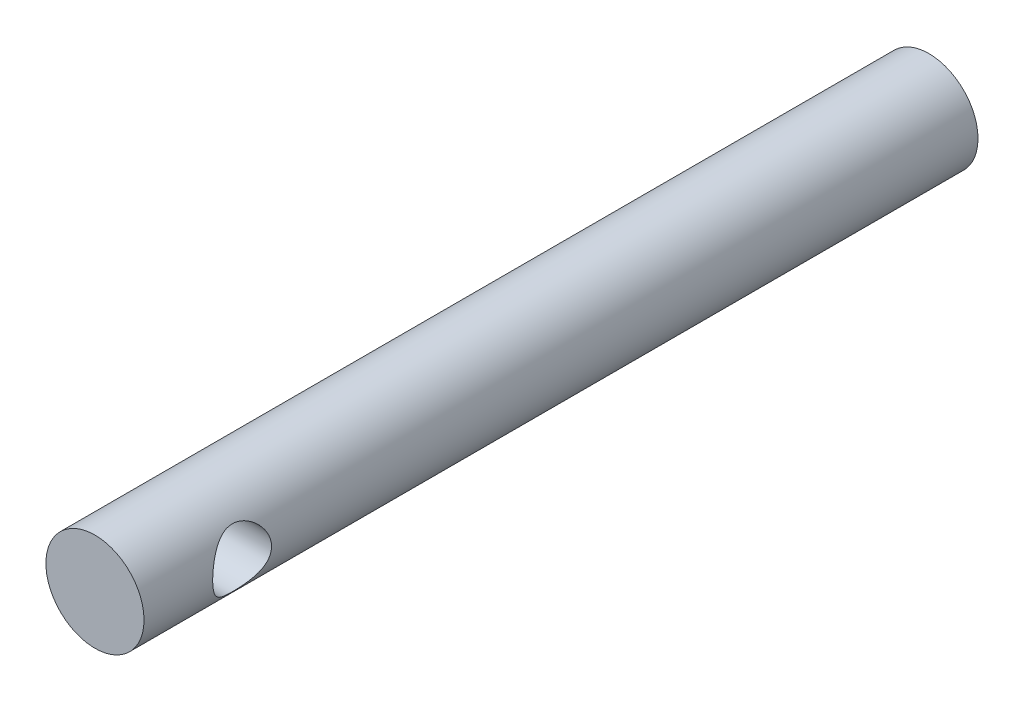
ISO-10303-21;
HEADER;
FILE_DESCRIPTION(('STEP AP214'),'2;1');
FILE_NAME('part.step','',(''),(''),'','','');
FILE_SCHEMA(('AUTOMOTIVE_DESIGN { 1 0 10303 214 1 1 1 1 }'));
ENDSEC;
DATA;
#1=APPLICATION_CONTEXT('core data for automotive mechanical design processes');
#2=APPLICATION_PROTOCOL_DEFINITION('international standard','automotive_design',2000,#1);
#3=PRODUCT_CONTEXT('',#1,'mechanical');
#4=PRODUCT('Part','Part','',(#3));
#5=PRODUCT_RELATED_PRODUCT_CATEGORY('part','',(#4));
#6=PRODUCT_DEFINITION_FORMATION('','',#4);
#7=PRODUCT_DEFINITION_CONTEXT('part definition',#1,'design');
#8=PRODUCT_DEFINITION('design','',#6,#7);
#9=PRODUCT_DEFINITION_SHAPE('','',#8);
#10=(LENGTH_UNIT() NAMED_UNIT(*) SI_UNIT(.MILLI.,.METRE.));
#11=(NAMED_UNIT(*) PLANE_ANGLE_UNIT() SI_UNIT($,.RADIAN.));
#12=(NAMED_UNIT(*) SI_UNIT($,.STERADIAN.) SOLID_ANGLE_UNIT());
#13=UNCERTAINTY_MEASURE_WITH_UNIT(LENGTH_MEASURE(1.E-05),#10,'distance_accuracy_value','');
#14=(GEOMETRIC_REPRESENTATION_CONTEXT(3) GLOBAL_UNCERTAINTY_ASSIGNED_CONTEXT((#13)) GLOBAL_UNIT_ASSIGNED_CONTEXT((#10,
#11,#12)) REPRESENTATION_CONTEXT('',''));
#15=CARTESIAN_POINT('',(0.,0.,0.));
#16=DIRECTION('',(0.,0.,1.));
#17=DIRECTION('',(1.,0.,0.));
#18=AXIS2_PLACEMENT_3D('',#15,#16,#17);
#19=CARTESIAN_POINT('',(0.,0.,42.5));
#20=DIRECTION('',(0.,0.,-1.));
#21=DIRECTION('',(-1.,0.,0.));
#22=AXIS2_PLACEMENT_3D('',#19,#20,#21);
#23=CYLINDRICAL_SURFACE('',#22,2.5);
#24=CARTESIAN_POINT('',(-2.5,0.,39.));
#25=CARTESIAN_POINT('',(-2.49999625789732,-0.076729833462016,38.9999959089901));
#26=CARTESIAN_POINT('',(-2.4964290461501,-0.153582320644178,38.9940713290737));
#27=CARTESIAN_POINT('',(-2.48249903608568,-0.304975509530679,38.9706756804847));
#28=CARTESIAN_POINT('',(-2.47211948032719,-0.379510034596047,38.9531761381458));
#29=CARTESIAN_POINT('',(-2.44561558054488,-0.523751827790838,38.9076136388332));
#30=CARTESIAN_POINT('',(-2.42951973272944,-0.593481028226568,38.8796030418369));
#31=CARTESIAN_POINT('',(-2.39295367626407,-0.727030318214661,38.814139666859));
#32=CARTESIAN_POINT('',(-2.37248455380255,-0.790851869416385,38.7766892330313));
#33=CARTESIAN_POINT('',(-2.32705360719087,-0.916299278999317,38.6902251732914));
#34=CARTESIAN_POINT('',(-2.30186792195985,-0.977384020081419,38.6405463046486));
#35=CARTESIAN_POINT('',(-2.25030439279633,-1.09088270411891,38.5325327961717));
#36=CARTESIAN_POINT('',(-2.2239250515357,-1.14328534948113,38.4741870628127));
#37=CARTESIAN_POINT('',(-2.1691106699591,-1.24444996762974,38.3420764895033));
#38=CARTESIAN_POINT('',(-2.14082017703649,-1.29197766378809,38.2672982290187));
#39=CARTESIAN_POINT('',(-2.08938301412124,-1.37361437764897,38.1091534267569));
#40=CARTESIAN_POINT('',(-2.06622802273937,-1.4077451733516,38.0258011037524));
#41=CARTESIAN_POINT('',(-2.0335462966093,-1.45440601714222,37.8734035493468));
#42=CARTESIAN_POINT('',(-2.02207883137591,-1.47016197246827,37.8057640013897));
#43=CARTESIAN_POINT('',(-2.00590308295502,-1.49216172340475,37.6681962841696));
#44=CARTESIAN_POINT('',(-2.00118639643759,-1.49841734556836,37.5982710712455));
#45=CARTESIAN_POINT('',(-1.99920922463856,-1.50105508796009,37.4579885057827));
#46=CARTESIAN_POINT('',(-2.00196337012717,-1.49741783408419,37.3876305749068));
#47=CARTESIAN_POINT('',(-2.01453261443741,-1.48046060478828,37.2487212245724));
#48=CARTESIAN_POINT('',(-2.02435302432225,-1.46713334620103,37.1801712041526));
#49=CARTESIAN_POINT('',(-2.04953186944258,-1.43173921881793,37.0474697578719));
#50=CARTESIAN_POINT('',(-2.06481711652537,-1.40978748666088,36.9832729460755));
#51=CARTESIAN_POINT('',(-2.09927051350828,-1.35795061770838,36.8593050090719));
#52=CARTESIAN_POINT('',(-2.11844008623464,-1.32806257259706,36.7995355165761));
#53=CARTESIAN_POINT('',(-2.16255327268985,-1.25517983184584,36.6750159028772));
#54=CARTESIAN_POINT('',(-2.18792043372991,-1.21080724397724,36.6112219070451));
#55=CARTESIAN_POINT('',(-2.2393059976438,-1.11291092784004,36.491323516333));
#56=CARTESIAN_POINT('',(-2.26532500262149,-1.0593784510058,36.4352265660235));
#57=CARTESIAN_POINT('',(-2.31935504958316,-0.935811834382984,36.3243870181783));
#58=CARTESIAN_POINT('',(-2.34713836268532,-0.864517682704975,36.270922693984));
#59=CARTESIAN_POINT('',(-2.3977242843398,-0.712276050459019,36.1768779528021));
#60=CARTESIAN_POINT('',(-2.42052955425515,-0.631333763943582,36.1362906462101));
#61=CARTESIAN_POINT('',(-2.45730392066151,-0.467197585268224,36.0720678172041));
#62=CARTESIAN_POINT('',(-2.47173957439703,-0.384467624173599,36.0475246442841));
#63=CARTESIAN_POINT('',(-2.4921884281355,-0.215047895144658,36.0129888025946));
#64=CARTESIAN_POINT('',(-2.49821172952738,-0.128363005661338,36.0029786822464));
#65=CARTESIAN_POINT('',(-2.5009057037461,0.0337146143773781,35.9984921523217));
#66=CARTESIAN_POINT('',(-2.49873521714286,0.1090424734187,36.0020911449148));
#67=CARTESIAN_POINT('',(-2.48778712087049,0.257829401986045,36.0204258530719));
#68=CARTESIAN_POINT('',(-2.47900964518038,0.331288509376091,36.0351613428058));
#69=CARTESIAN_POINT('',(-2.45594792442191,0.472574932157598,36.0745434328125));
#70=CARTESIAN_POINT('',(-2.44180275662556,0.540495750928468,36.0989403490735));
#71=CARTESIAN_POINT('',(-2.40913880862845,0.671265749087247,36.1566773763653));
#72=CARTESIAN_POINT('',(-2.39061916586512,0.734113924963894,36.1900192513467));
#73=CARTESIAN_POINT('',(-2.34845496237361,0.860006262823851,36.2685569792087));
#74=CARTESIAN_POINT('',(-2.3244780273988,0.922394150456825,36.3146238290784));
#75=CARTESIAN_POINT('',(-2.27474265574732,1.03902603131013,36.4153913934886));
#76=CARTESIAN_POINT('',(-2.24898216586361,1.09326040273737,36.4701021548525));
#77=CARTESIAN_POINT('',(-2.19445423909891,1.19931996735578,36.5949103900371));
#78=CARTESIAN_POINT('',(-2.16573241746292,1.24991019630914,36.6660838854655));
#79=CARTESIAN_POINT('',(-2.1121618206671,1.33845238915667,36.8172160245682));
#80=CARTESIAN_POINT('',(-2.0873089799769,1.37641766769781,36.8971652938928));
#81=CARTESIAN_POINT('',(-2.04984909240519,1.43142578795776,37.0462430223067));
#82=CARTESIAN_POINT('',(-2.03575659328729,1.4512162533619,37.1139803123586));
#83=CARTESIAN_POINT('',(-2.01409605743544,1.48113663905972,37.2525320780801));
#84=CARTESIAN_POINT('',(-2.0065189764272,1.49127995297631,37.3233421443278));
#85=CARTESIAN_POINT('',(-1.99900446616267,1.50134130416632,37.466376947597));
#86=CARTESIAN_POINT('',(-1.99909576445937,1.50122089107869,37.538605990687));
#87=CARTESIAN_POINT('',(-2.0069771789285,1.49066472959328,37.6818944356095));
#88=CARTESIAN_POINT('',(-2.0147714813882,1.48022337215759,37.7529531800806));
#89=CARTESIAN_POINT('',(-2.03633185242979,1.45040174148914,37.8884884175722));
#90=CARTESIAN_POINT('',(-2.0497921180558,1.43147636845352,37.9531170943069));
#91=CARTESIAN_POINT('',(-2.08105501960151,1.38563242076994,38.0783372544742));
#92=CARTESIAN_POINT('',(-2.09885929040482,1.3587108358848,38.1389272069605));
#93=CARTESIAN_POINT('',(-2.14012990550916,1.29289245555734,38.2643198572208));
#94=CARTESIAN_POINT('',(-2.16404587582639,1.25279167675754,38.3283411038543));
#95=CARTESIAN_POINT('',(-2.21320127030767,1.16375698389086,38.4493800726173));
#96=CARTESIAN_POINT('',(-2.2384417720502,1.114815796078,38.5063919621525));
#97=CARTESIAN_POINT('',(-2.29225690291476,1.00009777425736,38.6213509491317));
#98=CARTESIAN_POINT('',(-2.32070308663657,0.932876819313924,38.6779310748962));
#99=CARTESIAN_POINT('',(-2.37365428872367,0.78846243444561,38.7790978558633));
#100=CARTESIAN_POINT('',(-2.39815789310935,0.71126544450156,38.8236802119848));
#101=CARTESIAN_POINT('',(-2.43985578654394,0.551125230801473,38.8977858075737));
#102=CARTESIAN_POINT('',(-2.45725077479786,0.468430086957234,38.9277280649268));
#103=CARTESIAN_POINT('',(-2.48366273001246,0.297973306118827,38.972724695211));
#104=CARTESIAN_POINT('',(-2.49271125871485,0.21023209964863,38.987835167857));
#105=CARTESIAN_POINT('',(-2.49802001168187,0.10155809691755,38.9966974547087));
#106=CARTESIAN_POINT('',(-2.49876114656362,0.081276259028289,38.9979344173061));
#107=CARTESIAN_POINT('',(-2.49975164517367,0.0406658206871182,38.9995862463709));
#108=CARTESIAN_POINT('',(-2.50000099184316,0.0203372186375724,39.0000010843209));
#109=CARTESIAN_POINT('',(-2.5,0.,39.));
#110=B_SPLINE_CURVE_WITH_KNOTS('',3,(#24,#25,#26,#27,#28,#29,#30,#31,#32,#33,#34,#35,#36,#37,
#38,#39,#40,#41,#42,#43,#44,#45,#46,#47,#48,#49,#50,#51,#52,#53,#54,#55,#56,#57,#58,#59,#60,#61,
#62,#63,#64,#65,#66,#67,#68,#69,#70,#71,#72,#73,#74,#75,#76,#77,#78,#79,#80,#81,#82,#83,#84,#85,
#86,#87,#88,#89,#90,#91,#92,#93,#94,#95,#96,#97,#98,#99,#100,#101,#102,#103,#104,#105,#106,#107,
#108,#109),.UNSPECIFIED.,.T.,.F.,(4,2,2,2,2,2,2,2,2,2,2,2,2,2,2,2,2,2,2,2,2,2,2,2,2,2,2,2,2,2,2,
2,2,2,2,2,2,2,2,2,2,2,4),(0.,0.230102237548649,0.460772627520013,0.690308884600014,
0.919788197992279,1.16681590732473,1.41416257934801,1.69183813189807,1.96906040692092,
2.17933829855633,2.38935420916578,2.59978170870726,2.81036753273872,3.01823267593206,
3.22617409809868,3.47046995225162,3.71500044803673,3.9936095788469,4.27206939275324,
4.53296790696559,4.79355286918235,5.01875602722426,5.24395461863455,5.46367785689771,
5.68344445659025,5.92601365818362,6.16886690081836,6.44336762428009,6.71757792616456,
6.93257787314693,7.14727888733319,7.36278425777434,7.57840681155726,7.78364098331142,
7.98895251523035,8.22578610052286,8.46281544370208,8.73854311775519,9.01436946031985,
9.28175654462678,9.54812832184449,9.60911473335179,9.67010326027643),.UNSPECIFIED.);
#111=CARTESIAN_POINT('',(-2.5,0.,39.));
#112=VERTEX_POINT('',#111);
#113=EDGE_CURVE('E35',#112,#112,#110,.T.);
#114=ORIENTED_EDGE('',*,*,#113,.T.);
#115=EDGE_LOOP('',(#114));
#116=FACE_BOUND('',#115,.T.);
#117=CARTESIAN_POINT('',(2.5,0.,36.));
#118=CARTESIAN_POINT('',(2.49999625789732,-0.0767298334620158,36.0000040910099));
#119=CARTESIAN_POINT('',(2.4964290461501,-0.153582320644178,36.0059286709263));
#120=CARTESIAN_POINT('',(2.48249903608568,-0.304975509530679,36.0293243195153));
#121=CARTESIAN_POINT('',(2.47211948032719,-0.379510034596047,36.0468238618542));
#122=CARTESIAN_POINT('',(2.44561558054488,-0.523751827790836,36.0923863611669));
#123=CARTESIAN_POINT('',(2.42951973272944,-0.593481028226564,36.1203969581632));
#124=CARTESIAN_POINT('',(2.39295367626407,-0.727030318214658,36.185860333141));
#125=CARTESIAN_POINT('',(2.37248455380255,-0.790851869416383,36.2233107669687));
#126=CARTESIAN_POINT('',(2.32705360719087,-0.916299278999317,36.3097748267086));
#127=CARTESIAN_POINT('',(2.30186792195985,-0.977384020081419,36.3594536953514));
#128=CARTESIAN_POINT('',(2.25030439279633,-1.09088270411891,36.4674672038283));
#129=CARTESIAN_POINT('',(2.2239250515357,-1.14328534948113,36.5258129371873));
#130=CARTESIAN_POINT('',(2.1691106699591,-1.24444996762974,36.6579235104967));
#131=CARTESIAN_POINT('',(2.14082017703649,-1.29197766378809,36.7327017709813));
#132=CARTESIAN_POINT('',(2.08938301412124,-1.37361437764897,36.8908465732431));
#133=CARTESIAN_POINT('',(2.06622802273937,-1.4077451733516,36.9741988962476));
#134=CARTESIAN_POINT('',(2.0335462966093,-1.45440601714222,37.1265964506532));
#135=CARTESIAN_POINT('',(2.02207883137591,-1.47016197246827,37.1942359986103));
#136=CARTESIAN_POINT('',(2.00590308295502,-1.49216172340475,37.3318037158304));
#137=CARTESIAN_POINT('',(2.00118639643759,-1.49841734556836,37.4017289287545));
#138=CARTESIAN_POINT('',(1.99920922463856,-1.50105508796009,37.5420114942173));
#139=CARTESIAN_POINT('',(2.00196337012717,-1.49741783408419,37.6123694250932));
#140=CARTESIAN_POINT('',(2.01453261443741,-1.48046060478828,37.7512787754276));
#141=CARTESIAN_POINT('',(2.02435302432225,-1.46713334620103,37.8198287958474));
#142=CARTESIAN_POINT('',(2.04953186944258,-1.43173921881793,37.9525302421281));
#143=CARTESIAN_POINT('',(2.06481711652537,-1.40978748666088,38.0167270539245));
#144=CARTESIAN_POINT('',(2.09927051350828,-1.35795061770838,38.1406949909281));
#145=CARTESIAN_POINT('',(2.11844008623464,-1.32806257259706,38.2004644834239));
#146=CARTESIAN_POINT('',(2.16255327268985,-1.25517983184584,38.3249840971228));
#147=CARTESIAN_POINT('',(2.18792043372991,-1.21080724397724,38.3887780929549));
#148=CARTESIAN_POINT('',(2.2393059976438,-1.11291092784004,38.508676483667));
#149=CARTESIAN_POINT('',(2.26532500262149,-1.0593784510058,38.5647734339765));
#150=CARTESIAN_POINT('',(2.31935504958316,-0.935811834382983,38.6756129818218));
#151=CARTESIAN_POINT('',(2.34713836268532,-0.864517682704973,38.729077306016));
#152=CARTESIAN_POINT('',(2.3977242843398,-0.712276050459017,38.8231220471979));
#153=CARTESIAN_POINT('',(2.42052955425515,-0.631333763943581,38.86370935379));
#154=CARTESIAN_POINT('',(2.45730392066151,-0.467197585268224,38.9279321827959));
#155=CARTESIAN_POINT('',(2.47173957439703,-0.384467624173598,38.9524753557159));
#156=CARTESIAN_POINT('',(2.4921884281355,-0.215047895144657,38.9870111974054));
#157=CARTESIAN_POINT('',(2.49821172952738,-0.128363005661337,38.9970213177536));
#158=CARTESIAN_POINT('',(2.5009057037461,0.0337146143773784,39.0015078476783));
#159=CARTESIAN_POINT('',(2.49873521714286,0.109042473418701,38.9979088550852));
#160=CARTESIAN_POINT('',(2.48778712087049,0.257829401986045,38.9795741469281));
#161=CARTESIAN_POINT('',(2.47900964518038,0.331288509376091,38.9648386571942));
#162=CARTESIAN_POINT('',(2.45594792442191,0.472574932157598,38.9254565671876));
#163=CARTESIAN_POINT('',(2.44180275662556,0.540495750928468,38.9010596509265));
#164=CARTESIAN_POINT('',(2.40913880862845,0.671265749087247,38.8433226236347));
#165=CARTESIAN_POINT('',(2.39061916586512,0.734113924963894,38.8099807486533));
#166=CARTESIAN_POINT('',(2.34845496237361,0.860006262823851,38.7314430207913));
#167=CARTESIAN_POINT('',(2.3244780273988,0.922394150456825,38.6853761709216));
#168=CARTESIAN_POINT('',(2.27474265574732,1.03902603131013,38.5846086065114));
#169=CARTESIAN_POINT('',(2.24898216586361,1.09326040273737,38.5298978451475));
#170=CARTESIAN_POINT('',(2.19445423909891,1.19931996735578,38.4050896099629));
#171=CARTESIAN_POINT('',(2.16573241746292,1.24991019630914,38.3339161145345));
#172=CARTESIAN_POINT('',(2.1121618206671,1.33845238915667,38.1827839754318));
#173=CARTESIAN_POINT('',(2.0873089799769,1.37641766769781,38.1028347061072));
#174=CARTESIAN_POINT('',(2.04984909240519,1.43142578795776,37.9537569776933));
#175=CARTESIAN_POINT('',(2.03575659328729,1.4512162533619,37.8860196876414));
#176=CARTESIAN_POINT('',(2.01409605743544,1.48113663905972,37.7474679219199));
#177=CARTESIAN_POINT('',(2.0065189764272,1.49127995297631,37.6766578556722));
#178=CARTESIAN_POINT('',(1.99900446616267,1.50134130416632,37.533623052403));
#179=CARTESIAN_POINT('',(1.99909576445937,1.50122089107869,37.461394009313));
#180=CARTESIAN_POINT('',(2.0069771789285,1.49066472959328,37.3181055643906));
#181=CARTESIAN_POINT('',(2.0147714813882,1.48022337215759,37.2470468199194));
#182=CARTESIAN_POINT('',(2.03633185242979,1.45040174148914,37.1115115824278));
#183=CARTESIAN_POINT('',(2.0497921180558,1.43147636845352,37.0468829056932));
#184=CARTESIAN_POINT('',(2.08105501960151,1.38563242076994,36.9216627455258));
#185=CARTESIAN_POINT('',(2.09885929040481,1.3587108358848,36.8610727930395));
#186=CARTESIAN_POINT('',(2.14012990550916,1.29289245555734,36.7356801427792));
#187=CARTESIAN_POINT('',(2.16404587582639,1.25279167675754,36.6716588961457));
#188=CARTESIAN_POINT('',(2.21320127030767,1.16375698389086,36.5506199273827));
#189=CARTESIAN_POINT('',(2.2384417720502,1.114815796078,36.4936080378475));
#190=CARTESIAN_POINT('',(2.29225690291476,1.00009777425736,36.3786490508683));
#191=CARTESIAN_POINT('',(2.32070308663657,0.932876819313924,36.3220689251038));
#192=CARTESIAN_POINT('',(2.37365428872367,0.788462434445609,36.2209021441367));
#193=CARTESIAN_POINT('',(2.39815789310935,0.71126544450156,36.1763197880152));
#194=CARTESIAN_POINT('',(2.43985578654394,0.551125230801473,36.1022141924263));
#195=CARTESIAN_POINT('',(2.45725077479786,0.468430086957234,36.0722719350732));
#196=CARTESIAN_POINT('',(2.48366273001246,0.297973306118826,36.027275304789));
#197=CARTESIAN_POINT('',(2.49271125871485,0.21023209964863,36.012164832143));
#198=CARTESIAN_POINT('',(2.49802001168187,0.10155809691755,36.0033025452913));
#199=CARTESIAN_POINT('',(2.49876114656362,0.0812762590282883,36.0020655826939));
#200=CARTESIAN_POINT('',(2.49975164517367,0.0406658206871176,36.0004137536291));
#201=CARTESIAN_POINT('',(2.50000099184316,0.0203372186375721,35.9999989156791));
#202=CARTESIAN_POINT('',(2.5,0.,36.));
#203=B_SPLINE_CURVE_WITH_KNOTS('',3,(#117,#118,#119,#120,#121,#122,#123,#124,#125,#126,#127,
#128,#129,#130,#131,#132,#133,#134,#135,#136,#137,#138,#139,#140,#141,#142,#143,#144,#145,#146,
#147,#148,#149,#150,#151,#152,#153,#154,#155,#156,#157,#158,#159,#160,#161,#162,#163,#164,#165,
#166,#167,#168,#169,#170,#171,#172,#173,#174,#175,#176,#177,#178,#179,#180,#181,#182,#183,#184,
#185,#186,#187,#188,#189,#190,#191,#192,#193,#194,#195,#196,#197,#198,#199,#200,#201,#202),
.UNSPECIFIED.,.T.,.F.,(4,2,2,2,2,2,2,2,2,2,2,2,2,2,2,2,2,2,2,2,2,2,2,2,2,2,2,2,2,2,2,2,2,2,2,2,
2,2,2,2,2,2,4),(0.,0.230102237548649,0.460772627520013,0.690308884600009,0.919788197992279,
1.16681590732473,1.41416257934801,1.69183813189807,1.96906040692092,2.17933829855633,
2.38935420916578,2.59978170870726,2.81036753273872,3.01823267593207,3.22617409809868,
3.47046995225162,3.71500044803673,3.99360957884691,4.27206939275324,4.53296790696559,
4.79355286918235,5.01875602722426,5.24395461863455,5.46367785689772,5.68344445659025,
5.92601365818362,6.16886690081836,6.44336762428009,6.71757792616456,6.93257787314693,
7.14727888733319,7.36278425777434,7.57840681155726,7.78364098331141,7.98895251523036,
8.22578610052286,8.46281544370208,8.73854311775519,9.01436946031986,9.28175654462678,
9.54812832184449,9.60911473335179,9.67010326027643),.UNSPECIFIED.);
#204=CARTESIAN_POINT('',(2.5,0.,36.));
#205=VERTEX_POINT('',#204);
#206=EDGE_CURVE('E48',#205,#205,#203,.T.);
#207=ORIENTED_EDGE('',*,*,#206,.T.);
#208=EDGE_LOOP('',(#207));
#209=FACE_BOUND('',#208,.T.);
#210=CARTESIAN_POINT('',(0.,0.,42.5));
#211=DIRECTION('',(0.,0.,1.));
#212=DIRECTION('',(1.,0.,0.));
#213=AXIS2_PLACEMENT_3D('',#210,#211,#212);
#214=CIRCLE('',#213,2.5);
#215=CARTESIAN_POINT('',(2.5,0.,42.5));
#216=VERTEX_POINT('',#215);
#217=EDGE_CURVE('E10',#216,#216,#214,.T.);
#218=ORIENTED_EDGE('',*,*,#217,.F.);
#219=EDGE_LOOP('',(#218));
#220=FACE_BOUND('',#219,.T.);
#221=CARTESIAN_POINT('',(0.,0.,0.));
#222=DIRECTION('',(0.,0.,1.));
#223=DIRECTION('',(1.,0.,0.));
#224=AXIS2_PLACEMENT_3D('',#221,#222,#223);
#225=CIRCLE('',#224,2.5);
#226=CARTESIAN_POINT('',(2.5,0.,0.));
#227=VERTEX_POINT('',#226);
#228=EDGE_CURVE('E42',#227,#227,#225,.T.);
#229=ORIENTED_EDGE('',*,*,#228,.T.);
#230=EDGE_LOOP('',(#229));
#231=FACE_BOUND('',#230,.T.);
#232=ADVANCED_FACE('F31',(#116,#209,#220,#231),#23,.T.);
#233=CARTESIAN_POINT('',(0.,0.,42.5));
#234=DIRECTION('',(0.,0.,1.));
#235=DIRECTION('',(1.,0.,0.));
#236=AXIS2_PLACEMENT_3D('',#233,#234,#235);
#237=PLANE('',#236);
#238=ORIENTED_EDGE('',*,*,#217,.T.);
#239=EDGE_LOOP('',(#238));
#240=FACE_BOUND('',#239,.T.);
#241=ADVANCED_FACE('F58',(#240),#237,.T.);
#242=CARTESIAN_POINT('',(0.,0.,0.));
#243=DIRECTION('',(0.,0.,1.));
#244=DIRECTION('',(1.,0.,0.));
#245=AXIS2_PLACEMENT_3D('',#242,#243,#244);
#246=PLANE('',#245);
#247=ORIENTED_EDGE('',*,*,#228,.F.);
#248=EDGE_LOOP('',(#247));
#249=FACE_BOUND('',#248,.T.);
#250=ADVANCED_FACE('F56',(#249),#246,.F.);
#251=CARTESIAN_POINT('',(-25.,0.,37.5));
#252=DIRECTION('',(1.,0.,0.));
#253=DIRECTION('',(0.,0.,-1.));
#254=AXIS2_PLACEMENT_3D('',#251,#252,#253);
#255=CYLINDRICAL_SURFACE('',#254,1.5);
#256=ORIENTED_EDGE('',*,*,#206,.F.);
#257=EDGE_LOOP('',(#256));
#258=FACE_BOUND('',#257,.T.);
#259=ORIENTED_EDGE('',*,*,#113,.F.);
#260=EDGE_LOOP('',(#259));
#261=FACE_BOUND('',#260,.T.);
#262=ADVANCED_FACE('F52',(#258,#261),#255,.F.);
#263=CLOSED_SHELL('',(#232,#241,#250,#262));
#264=MANIFOLD_SOLID_BREP('B2',#263);
#265=ADVANCED_BREP_SHAPE_REPRESENTATION('',(#18,#264),#14);
#266=SHAPE_DEFINITION_REPRESENTATION(#9,#265);
ENDSEC;
END-ISO-10303-21;
